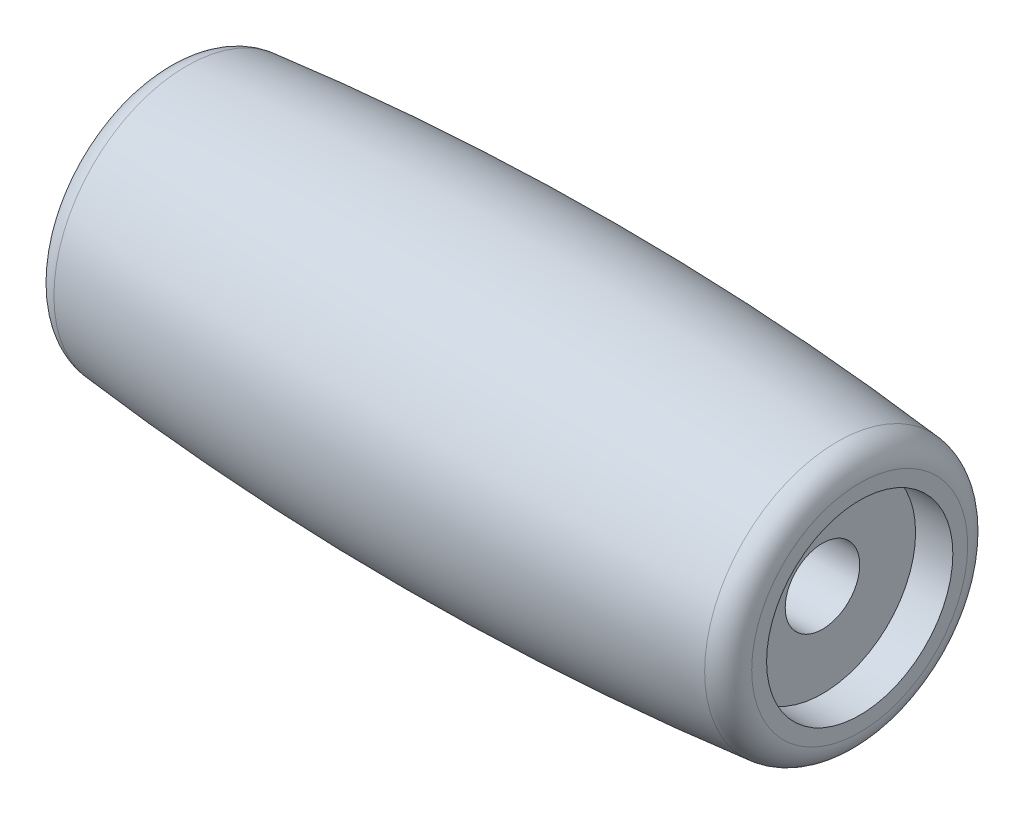
ISO-10303-21;
HEADER;
FILE_DESCRIPTION(('STEP AP214'),'2;1');
FILE_NAME('part.step','',(''),(''),'','','');
FILE_SCHEMA(('AUTOMOTIVE_DESIGN { 1 0 10303 214 1 1 1 1 }'));
ENDSEC;
DATA;
#1=APPLICATION_CONTEXT('core data for automotive mechanical design processes');
#2=APPLICATION_PROTOCOL_DEFINITION('international standard','automotive_design',2000,#1);
#3=PRODUCT_CONTEXT('',#1,'mechanical');
#4=PRODUCT('Part','Part','',(#3));
#5=PRODUCT_RELATED_PRODUCT_CATEGORY('part','',(#4));
#6=PRODUCT_DEFINITION_FORMATION('','',#4);
#7=PRODUCT_DEFINITION_CONTEXT('part definition',#1,'design');
#8=PRODUCT_DEFINITION('design','',#6,#7);
#9=PRODUCT_DEFINITION_SHAPE('','',#8);
#10=(LENGTH_UNIT() NAMED_UNIT(*) SI_UNIT(.MILLI.,.METRE.));
#11=(NAMED_UNIT(*) PLANE_ANGLE_UNIT() SI_UNIT($,.RADIAN.));
#12=(NAMED_UNIT(*) SI_UNIT($,.STERADIAN.) SOLID_ANGLE_UNIT());
#13=UNCERTAINTY_MEASURE_WITH_UNIT(LENGTH_MEASURE(1.E-05),#10,'distance_accuracy_value','');
#14=(GEOMETRIC_REPRESENTATION_CONTEXT(3) GLOBAL_UNCERTAINTY_ASSIGNED_CONTEXT((#13)) GLOBAL_UNIT_ASSIGNED_CONTEXT((#10,
#11,#12)) REPRESENTATION_CONTEXT('',''));
#15=CARTESIAN_POINT('',(0.,0.,0.));
#16=DIRECTION('',(0.,0.,1.));
#17=DIRECTION('',(1.,0.,0.));
#18=AXIS2_PLACEMENT_3D('',#15,#16,#17);
#19=CARTESIAN_POINT('',(12.5,1.5,0.));
#20=DIRECTION('',(-1.,0.,0.));
#21=DIRECTION('',(0.,0.,1.));
#22=AXIS2_PLACEMENT_3D('',#19,#20,#21);
#23=PLANE('',#22);
#24=CARTESIAN_POINT('',(12.5,0.,0.));
#25=DIRECTION('',(-1.,0.,0.));
#26=DIRECTION('',(0.,0.,1.));
#27=AXIS2_PLACEMENT_3D('',#24,#25,#26);
#28=CIRCLE('',#27,3.75);
#29=CARTESIAN_POINT('',(12.5,0.,3.75));
#30=VERTEX_POINT('',#29);
#31=EDGE_CURVE('E10',#30,#30,#28,.T.);
#32=ORIENTED_EDGE('',*,*,#31,.F.);
#33=EDGE_LOOP('',(#32));
#34=FACE_BOUND('',#33,.T.);
#35=CARTESIAN_POINT('',(12.5,0.,0.));
#36=DIRECTION('',(-1.,0.,0.));
#37=DIRECTION('',(0.,0.,1.));
#38=AXIS2_PLACEMENT_3D('',#35,#36,#37);
#39=CIRCLE('',#38,1.5);
#40=CARTESIAN_POINT('',(12.5,0.,1.5));
#41=VERTEX_POINT('',#40);
#42=EDGE_CURVE('E66',#41,#41,#39,.T.);
#43=ORIENTED_EDGE('',*,*,#42,.T.);
#44=EDGE_LOOP('',(#43));
#45=FACE_BOUND('',#44,.T.);
#46=ADVANCED_FACE('F32',(#34,#45),#23,.F.);
#47=CARTESIAN_POINT('',(0.,0.,0.));
#48=DIRECTION('',(-1.,0.,0.));
#49=DIRECTION('',(0.,0.,1.));
#50=AXIS2_PLACEMENT_3D('',#47,#48,#49);
#51=CYLINDRICAL_SURFACE('',#50,3.75);
#52=CARTESIAN_POINT('',(14.,0.,0.));
#53=DIRECTION('',(-1.,0.,0.));
#54=DIRECTION('',(0.,0.,1.));
#55=AXIS2_PLACEMENT_3D('',#52,#53,#54);
#56=CIRCLE('',#55,3.75);
#57=CARTESIAN_POINT('',(14.,0.,3.75));
#58=VERTEX_POINT('',#57);
#59=EDGE_CURVE('E38',#58,#58,#56,.T.);
#60=ORIENTED_EDGE('',*,*,#59,.F.);
#61=EDGE_LOOP('',(#60));
#62=FACE_BOUND('',#61,.T.);
#63=ORIENTED_EDGE('',*,*,#31,.T.);
#64=EDGE_LOOP('',(#63));
#65=FACE_BOUND('',#64,.T.);
#66=ADVANCED_FACE('F115',(#62,#65),#51,.F.);
#67=CARTESIAN_POINT('',(14.,3.75,0.));
#68=DIRECTION('',(-1.,0.,0.));
#69=DIRECTION('',(0.,0.,1.));
#70=AXIS2_PLACEMENT_3D('',#67,#68,#69);
#71=PLANE('',#70);
#72=CARTESIAN_POINT('',(14.,0.,0.));
#73=DIRECTION('',(-1.,0.,0.));
#74=DIRECTION('',(0.,0.,1.));
#75=AXIS2_PLACEMENT_3D('',#72,#73,#74);
#76=CIRCLE('',#75,4.34857666506388);
#77=CARTESIAN_POINT('',(14.,0.,4.34857666506388));
#78=VERTEX_POINT('',#77);
#79=EDGE_CURVE('E42',#78,#78,#76,.T.);
#80=ORIENTED_EDGE('',*,*,#79,.F.);
#81=EDGE_LOOP('',(#80));
#82=FACE_BOUND('',#81,.T.);
#83=ORIENTED_EDGE('',*,*,#59,.T.);
#84=EDGE_LOOP('',(#83));
#85=FACE_BOUND('',#84,.T.);
#86=ADVANCED_FACE('F110',(#82,#85),#71,.F.);
#87=CARTESIAN_POINT('',(13.,0.,0.));
#88=DIRECTION('',(-1.,0.,0.));
#89=DIRECTION('',(0.,0.,1.));
#90=AXIS2_PLACEMENT_3D('',#87,#88,#89);
#91=TOROIDAL_SURFACE('',#90,4.34857666506388,1.00000000000001);
#92=CARTESIAN_POINT('',(13.0999679589875,0.,0.));
#93=DIRECTION('',(-1.,0.,0.));
#94=DIRECTION('',(0.,0.,1.));
#95=AXIS2_PLACEMENT_3D('',#92,#93,#94);
#96=CIRCLE('',#95,5.34356732189234);
#97=CARTESIAN_POINT('',(13.0999679589875,0.,5.34356732189234));
#98=VERTEX_POINT('',#97);
#99=EDGE_CURVE('E46',#98,#98,#96,.T.);
#100=ORIENTED_EDGE('',*,*,#99,.F.);
#101=EDGE_LOOP('',(#100));
#102=FACE_BOUND('',#101,.T.);
#103=ORIENTED_EDGE('',*,*,#79,.T.);
#104=EDGE_LOOP('',(#103));
#105=FACE_BOUND('',#104,.T.);
#106=ADVANCED_FACE('F104',(#102,#105),#91,.T.);
#107=CARTESIAN_POINT('',(0.,0.,0.));
#108=DIRECTION('',(-1.,0.,0.));
#109=DIRECTION('',(0.,0.,1.));
#110=AXIS2_PLACEMENT_3D('',#107,#108,#109);
#111=DEGENERATE_TOROIDAL_SURFACE('',#110,125.041666666667,131.041666666667,.F.);
#112=CARTESIAN_POINT('',(-13.0999679589875,0.,0.));
#113=DIRECTION('',(-1.,0.,0.));
#114=DIRECTION('',(0.,0.,1.));
#115=AXIS2_PLACEMENT_3D('',#112,#113,#114);
#116=CIRCLE('',#115,5.34356732189233);
#117=CARTESIAN_POINT('',(-13.0999679589875,0.,5.34356732189233));
#118=VERTEX_POINT('',#117);
#119=EDGE_CURVE('E51',#118,#118,#116,.T.);
#120=ORIENTED_EDGE('',*,*,#119,.F.);
#121=EDGE_LOOP('',(#120));
#122=FACE_BOUND('',#121,.T.);
#123=ORIENTED_EDGE('',*,*,#99,.T.);
#124=EDGE_LOOP('',(#123));
#125=FACE_BOUND('',#124,.T.);
#126=ADVANCED_FACE('F98',(#122,#125),#111,.F.);
#127=CARTESIAN_POINT('',(-13.,0.,0.));
#128=DIRECTION('',(-1.,0.,0.));
#129=DIRECTION('',(0.,0.,1.));
#130=AXIS2_PLACEMENT_3D('',#127,#128,#129);
#131=TOROIDAL_SURFACE('',#130,4.34857666506388,1.00000000000001);
#132=CARTESIAN_POINT('',(-14.,0.,0.));
#133=DIRECTION('',(-1.,0.,0.));
#134=DIRECTION('',(0.,0.,1.));
#135=AXIS2_PLACEMENT_3D('',#132,#133,#134);
#136=CIRCLE('',#135,4.34857666506388);
#137=CARTESIAN_POINT('',(-14.,0.,4.34857666506388));
#138=VERTEX_POINT('',#137);
#139=EDGE_CURVE('E54',#138,#138,#136,.T.);
#140=ORIENTED_EDGE('',*,*,#139,.F.);
#141=EDGE_LOOP('',(#140));
#142=FACE_BOUND('',#141,.T.);
#143=ORIENTED_EDGE('',*,*,#119,.T.);
#144=EDGE_LOOP('',(#143));
#145=FACE_BOUND('',#144,.T.);
#146=ADVANCED_FACE('F92',(#142,#145),#131,.T.);
#147=CARTESIAN_POINT('',(-14.,3.75,0.));
#148=DIRECTION('',(1.,0.,0.));
#149=DIRECTION('',(0.,0.,-1.));
#150=AXIS2_PLACEMENT_3D('',#147,#148,#149);
#151=PLANE('',#150);
#152=CARTESIAN_POINT('',(-14.,0.,0.));
#153=DIRECTION('',(-1.,0.,0.));
#154=DIRECTION('',(0.,0.,1.));
#155=AXIS2_PLACEMENT_3D('',#152,#153,#154);
#156=CIRCLE('',#155,3.75);
#157=CARTESIAN_POINT('',(-14.,0.,3.75));
#158=VERTEX_POINT('',#157);
#159=EDGE_CURVE('E57',#158,#158,#156,.T.);
#160=ORIENTED_EDGE('',*,*,#159,.F.);
#161=EDGE_LOOP('',(#160));
#162=FACE_BOUND('',#161,.T.);
#163=ORIENTED_EDGE('',*,*,#139,.T.);
#164=EDGE_LOOP('',(#163));
#165=FACE_BOUND('',#164,.T.);
#166=ADVANCED_FACE('F86',(#162,#165),#151,.F.);
#167=CARTESIAN_POINT('',(0.,0.,0.));
#168=DIRECTION('',(-1.,0.,0.));
#169=DIRECTION('',(0.,0.,1.));
#170=AXIS2_PLACEMENT_3D('',#167,#168,#169);
#171=CYLINDRICAL_SURFACE('',#170,3.75);
#172=CARTESIAN_POINT('',(-12.5,0.,0.));
#173=DIRECTION('',(-1.,0.,0.));
#174=DIRECTION('',(0.,0.,1.));
#175=AXIS2_PLACEMENT_3D('',#172,#173,#174);
#176=CIRCLE('',#175,3.75);
#177=CARTESIAN_POINT('',(-12.5,0.,3.75));
#178=VERTEX_POINT('',#177);
#179=EDGE_CURVE('E60',#178,#178,#176,.T.);
#180=ORIENTED_EDGE('',*,*,#179,.F.);
#181=EDGE_LOOP('',(#180));
#182=FACE_BOUND('',#181,.T.);
#183=ORIENTED_EDGE('',*,*,#159,.T.);
#184=EDGE_LOOP('',(#183));
#185=FACE_BOUND('',#184,.T.);
#186=ADVANCED_FACE('F80',(#182,#185),#171,.F.);
#187=CARTESIAN_POINT('',(-12.5,1.5,0.));
#188=DIRECTION('',(1.,0.,0.));
#189=DIRECTION('',(0.,0.,-1.));
#190=AXIS2_PLACEMENT_3D('',#187,#188,#189);
#191=PLANE('',#190);
#192=CARTESIAN_POINT('',(-12.5,0.,0.));
#193=DIRECTION('',(-1.,0.,0.));
#194=DIRECTION('',(0.,0.,1.));
#195=AXIS2_PLACEMENT_3D('',#192,#193,#194);
#196=CIRCLE('',#195,1.5);
#197=CARTESIAN_POINT('',(-12.5,0.,1.5));
#198=VERTEX_POINT('',#197);
#199=EDGE_CURVE('E63',#198,#198,#196,.T.);
#200=ORIENTED_EDGE('',*,*,#199,.F.);
#201=EDGE_LOOP('',(#200));
#202=FACE_BOUND('',#201,.T.);
#203=ORIENTED_EDGE('',*,*,#179,.T.);
#204=EDGE_LOOP('',(#203));
#205=FACE_BOUND('',#204,.T.);
#206=ADVANCED_FACE('F74',(#202,#205),#191,.F.);
#207=CARTESIAN_POINT('',(0.,0.,0.));
#208=DIRECTION('',(-1.,0.,0.));
#209=DIRECTION('',(0.,0.,1.));
#210=AXIS2_PLACEMENT_3D('',#207,#208,#209);
#211=CYLINDRICAL_SURFACE('',#210,1.5);
#212=ORIENTED_EDGE('',*,*,#42,.F.);
#213=EDGE_LOOP('',(#212));
#214=FACE_BOUND('',#213,.T.);
#215=ORIENTED_EDGE('',*,*,#199,.T.);
#216=EDGE_LOOP('',(#215));
#217=FACE_BOUND('',#216,.T.);
#218=ADVANCED_FACE('F71',(#214,#217),#211,.F.);
#219=CLOSED_SHELL('',(#46,#66,#86,#106,#126,#146,#166,#186,#206,#218));
#220=MANIFOLD_SOLID_BREP('B2',#219);
#221=ADVANCED_BREP_SHAPE_REPRESENTATION('',(#18,#220),#14);
#222=SHAPE_DEFINITION_REPRESENTATION(#9,#221);
ENDSEC;
END-ISO-10303-21;
